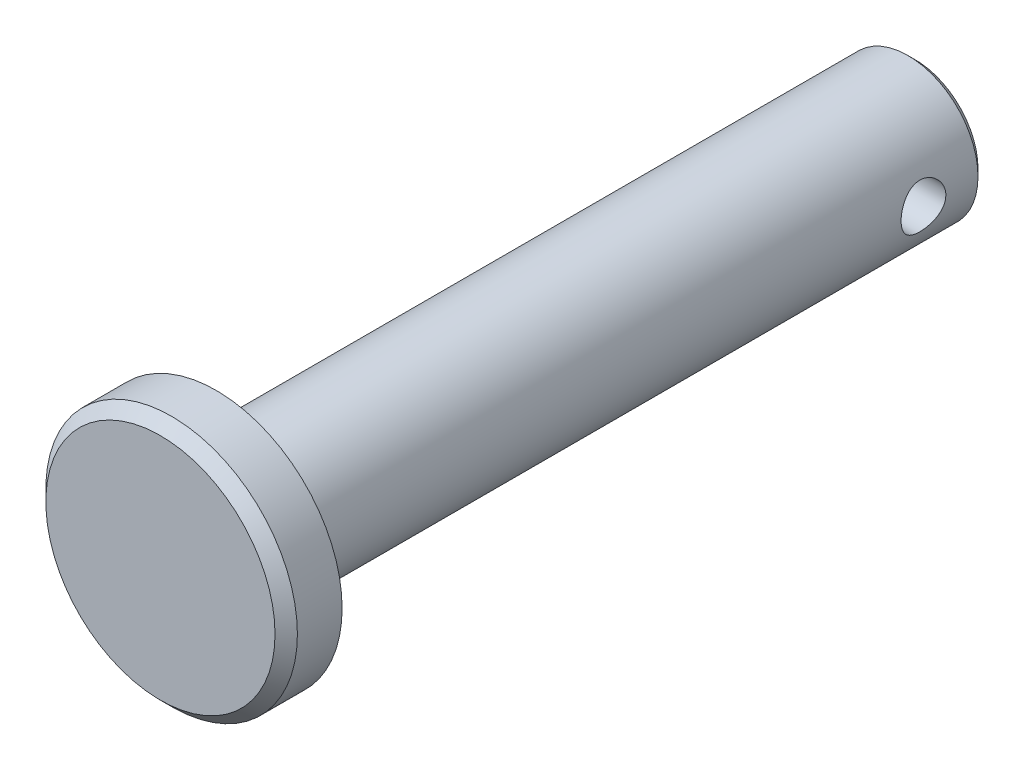
ISO-10303-21;
HEADER;
FILE_DESCRIPTION(('STEP AP214'),'2;1');
FILE_NAME('part.step','',(''),(''),'','','');
FILE_SCHEMA(('AUTOMOTIVE_DESIGN { 1 0 10303 214 1 1 1 1 }'));
ENDSEC;
DATA;
#1=APPLICATION_CONTEXT('core data for automotive mechanical design processes');
#2=APPLICATION_PROTOCOL_DEFINITION('international standard','automotive_design',2000,#1);
#3=PRODUCT_CONTEXT('',#1,'mechanical');
#4=PRODUCT('Part','Part','',(#3));
#5=PRODUCT_RELATED_PRODUCT_CATEGORY('part','',(#4));
#6=PRODUCT_DEFINITION_FORMATION('','',#4);
#7=PRODUCT_DEFINITION_CONTEXT('part definition',#1,'design');
#8=PRODUCT_DEFINITION('design','',#6,#7);
#9=PRODUCT_DEFINITION_SHAPE('','',#8);
#10=(LENGTH_UNIT() NAMED_UNIT(*) SI_UNIT(.MILLI.,.METRE.));
#11=(NAMED_UNIT(*) PLANE_ANGLE_UNIT() SI_UNIT($,.RADIAN.));
#12=(NAMED_UNIT(*) SI_UNIT($,.STERADIAN.) SOLID_ANGLE_UNIT());
#13=UNCERTAINTY_MEASURE_WITH_UNIT(LENGTH_MEASURE(1.E-05),#10,'distance_accuracy_value','');
#14=(GEOMETRIC_REPRESENTATION_CONTEXT(3) GLOBAL_UNCERTAINTY_ASSIGNED_CONTEXT((#13)) GLOBAL_UNIT_ASSIGNED_CONTEXT((#10,
#11,#12)) REPRESENTATION_CONTEXT('',''));
#15=CARTESIAN_POINT('',(0.,0.,0.));
#16=DIRECTION('',(0.,0.,1.));
#17=DIRECTION('',(1.,0.,0.));
#18=AXIS2_PLACEMENT_3D('',#15,#16,#17);
#19=CARTESIAN_POINT('',(0.,0.,25.));
#20=DIRECTION('',(0.,0.,-1.));
#21=DIRECTION('',(-1.,0.,0.));
#22=AXIS2_PLACEMENT_3D('',#19,#20,#21);
#23=CYLINDRICAL_SURFACE('',#22,5.);
#24=CARTESIAN_POINT('',(0.,0.,-24.5));
#25=DIRECTION('',(0.,0.,1.));
#26=DIRECTION('',(1.,0.,0.));
#27=AXIS2_PLACEMENT_3D('',#24,#25,#26);
#28=CIRCLE('',#27,5.);
#29=CARTESIAN_POINT('',(5.,0.,-24.5));
#30=VERTEX_POINT('',#29);
#31=EDGE_CURVE('E57',#30,#30,#28,.T.);
#32=ORIENTED_EDGE('',*,*,#31,.T.);
#33=EDGE_LOOP('',(#32));
#34=FACE_BOUND('',#33,.T.);
#35=CARTESIAN_POINT('',(-5.,0.,-19.));
#36=CARTESIAN_POINT('',(-4.99999978543627,-0.0874958063159799,-19.0000002436506));
#37=CARTESIAN_POINT('',(-4.99768184156355,-0.174994637059061,-19.0072005952793));
#38=CARTESIAN_POINT('',(-4.98866262172227,-0.347426901237484,-19.0357318195293));
#39=CARTESIAN_POINT('',(-4.98196054553558,-0.432359863373709,-19.0570652718179));
#40=CARTESIAN_POINT('',(-4.9649038363541,-0.597149225791566,-19.1130649212118));
#41=CARTESIAN_POINT('',(-4.95455502045191,-0.677013473384596,-19.1477098923706));
#42=CARTESIAN_POINT('',(-4.93126901642872,-0.829798762851158,-19.2292568300873));
#43=CARTESIAN_POINT('',(-4.91833138300386,-0.902718607024947,-19.2761609057656));
#44=CARTESIAN_POINT('',(-4.89077067933825,-1.04189475779498,-19.382484113504));
#45=CARTESIAN_POINT('',(-4.87610957732918,-1.1078960922464,-19.4422270989534));
#46=CARTESIAN_POINT('',(-4.8469706570307,-1.22913423693228,-19.5718430665474));
#47=CARTESIAN_POINT('',(-4.83249287552328,-1.28436891793797,-19.6417180476549));
#48=CARTESIAN_POINT('',(-4.80494810799029,-1.38391395073832,-19.7918528545104));
#49=CARTESIAN_POINT('',(-4.79192785635417,-1.42790123109944,-19.8723362812705));
#50=CARTESIAN_POINT('',(-4.76934657798646,-1.5016091713459,-20.0400423437701));
#51=CARTESIAN_POINT('',(-4.75978458968016,-1.53133379773327,-20.1272630979883));
#52=CARTESIAN_POINT('',(-4.74560122760597,-1.57473134311322,-20.3030826072729));
#53=CARTESIAN_POINT('',(-4.74083414932744,-1.58887896846386,-20.391552101752));
#54=CARTESIAN_POINT('',(-4.73634831045,-1.60220433058851,-20.5697275991845));
#55=CARTESIAN_POINT('',(-4.73662813227306,-1.6013862709372,-20.659433247852));
#56=CARTESIAN_POINT('',(-4.74207619100075,-1.58517380736381,-20.8335655848882));
#57=CARTESIAN_POINT('',(-4.7470401743042,-1.57038842132725,-20.9180564534447));
#58=CARTESIAN_POINT('',(-4.76096457446162,-1.52765058974139,-21.0832888444221));
#59=CARTESIAN_POINT('',(-4.76992543490025,-1.49969668269327,-21.1640299495852));
#60=CARTESIAN_POINT('',(-4.7909865416364,-1.43099645158812,-21.3208978588257));
#61=CARTESIAN_POINT('',(-4.80313229469362,-1.39006273103723,-21.3969362199515));
#62=CARTESIAN_POINT('',(-4.82917444861168,-1.29669494334068,-21.5412620430268));
#63=CARTESIAN_POINT('',(-4.8430713221454,-1.24425776827155,-21.6095474027435));
#64=CARTESIAN_POINT('',(-4.87186372141871,-1.12640551540387,-21.7398646728663));
#65=CARTESIAN_POINT('',(-4.8867752080818,-1.06048936249402,-21.8014407769388));
#66=CARTESIAN_POINT('',(-4.91533168114877,-0.919081432217151,-21.9127786782336));
#67=CARTESIAN_POINT('',(-4.92897656433707,-0.843588875652697,-21.9625395131429));
#68=CARTESIAN_POINT('',(-4.95361789744584,-0.684261580712376,-22.0491634432802));
#69=CARTESIAN_POINT('',(-4.96459080547942,-0.600361279440636,-22.0859131008364));
#70=CARTESIAN_POINT('',(-4.98248161100196,-0.42713585036113,-22.1446395966627));
#71=CARTESIAN_POINT('',(-4.98940080204637,-0.337812463131548,-22.1666211478167));
#72=CARTESIAN_POINT('',(-4.99819424239135,-0.160141789589318,-22.1944000666652));
#73=CARTESIAN_POINT('',(-5.00026060178154,-0.0719002860170731,-22.2008140736111));
#74=CARTESIAN_POINT('',(-4.99968655318444,0.104410269588106,-22.1990207817787));
#75=CARTESIAN_POINT('',(-4.99704687004206,0.19247934608744,-22.1908157346901));
#76=CARTESIAN_POINT('',(-4.98748380317497,0.363535018203813,-22.1605098869188));
#77=CARTESIAN_POINT('',(-4.98067486649266,0.446594362478024,-22.1387800899141));
#78=CARTESIAN_POINT('',(-4.96357585995349,0.607861654600584,-22.0824982006037));
#79=CARTESIAN_POINT('',(-4.95328535439547,0.686068993794125,-22.0479445033978));
#80=CARTESIAN_POINT('',(-4.92995531019905,0.837596923870446,-21.9660289828218));
#81=CARTESIAN_POINT('',(-4.9168532627009,0.910745620500969,-21.9183674880577));
#82=CARTESIAN_POINT('',(-4.8893940824048,1.04821150300662,-21.8119461270144));
#83=CARTESIAN_POINT('',(-4.87503659432078,1.11252617555399,-21.7531831135417));
#84=CARTESIAN_POINT('',(-4.84592967283237,1.23328321488635,-21.623325840389));
#85=CARTESIAN_POINT('',(-4.83118884166735,1.2892857947562,-21.5518197323115));
#86=CARTESIAN_POINT('',(-4.80360443110145,1.38854141992569,-21.4001053255418));
#87=CARTESIAN_POINT('',(-4.79076083607138,1.43179457025642,-21.319897098546));
#88=CARTESIAN_POINT('',(-4.76856262886575,1.50407580301232,-21.1531564213439));
#89=CARTESIAN_POINT('',(-4.75919656820051,1.53315066307446,-21.0666458650103));
#90=CARTESIAN_POINT('',(-4.74511281699328,1.57620668246201,-20.8895927901897));
#91=CARTESIAN_POINT('',(-4.74039324536734,1.59019395006567,-20.799051918864));
#92=CARTESIAN_POINT('',(-4.73633927898768,1.60222535311566,-20.621124030836));
#93=CARTESIAN_POINT('',(-4.73676019091382,1.60099388446006,-20.533790988671));
#94=CARTESIAN_POINT('',(-4.74234159093745,1.5843835514937,-20.3606429945653));
#95=CARTESIAN_POINT('',(-4.74750183734632,1.56900540861121,-20.274827965439));
#96=CARTESIAN_POINT('',(-4.76180543144416,1.52503332416461,-20.1085165746231));
#97=CARTESIAN_POINT('',(-4.77088327236763,1.49665627942707,-20.0279568011071));
#98=CARTESIAN_POINT('',(-4.79197975594362,1.42766427484382,-19.8726782395992));
#99=CARTESIAN_POINT('',(-4.8039990169992,1.38704674114626,-19.7979606842373));
#100=CARTESIAN_POINT('',(-4.83023494368376,1.29279266707432,-19.6531903701856));
#101=CARTESIAN_POINT('',(-4.8445211905268,1.23869308431579,-19.583451737266));
#102=CARTESIAN_POINT('',(-4.87337180847354,1.11981399792885,-19.453808254179));
#103=CARTESIAN_POINT('',(-4.88793625446696,1.05503158166823,-19.3939060948013));
#104=CARTESIAN_POINT('',(-4.91631108200117,0.913912210298352,-19.2835417140762));
#105=CARTESIAN_POINT('',(-4.93007751880386,0.83725135176078,-19.2334810481157));
#106=CARTESIAN_POINT('',(-4.95473787697861,0.676163529926937,-19.1470198119028));
#107=CARTESIAN_POINT('',(-4.96563279071293,0.591739263208158,-19.1106145206792));
#108=CARTESIAN_POINT('',(-4.98268341064065,0.423663431644846,-19.0547522201696));
#109=CARTESIAN_POINT('',(-4.98911901301451,0.340376766487331,-19.0342815494169));
#110=CARTESIAN_POINT('',(-4.99777693541394,0.171394001076119,-19.006906857096));
#111=CARTESIAN_POINT('',(-5.00000021015613,0.0856984512613948,-18.9999997613545));
#112=CARTESIAN_POINT('',(-5.,0.,-19.));
#113=B_SPLINE_CURVE_WITH_KNOTS('',3,(#35,#36,#37,#38,#39,#40,#41,#42,#43,#44,#45,#46,#47,#48,
#49,#50,#51,#52,#53,#54,#55,#56,#57,#58,#59,#60,#61,#62,#63,#64,#65,#66,#67,#68,#69,#70,#71,#72,
#73,#74,#75,#76,#77,#78,#79,#80,#81,#82,#83,#84,#85,#86,#87,#88,#89,#90,#91,#92,#93,#94,#95,#96,
#97,#98,#99,#100,#101,#102,#103,#104,#105,#106,#107,#108,#109,#110,#111,#112),.UNSPECIFIED.,.T.,
.F.,(4,2,2,2,2,2,2,2,2,2,2,2,2,2,2,2,2,2,2,2,2,2,2,2,2,2,2,2,2,2,2,2,2,2,2,2,2,2,4),(0.,
0.262172289866488,0.524392446348365,0.786196202111713,1.04804502964703,1.31749718151567,
1.58700256668426,1.86354828826627,2.14001705671955,2.40780489999507,2.67551752794224,
2.93207089351446,3.18865273918779,3.44912195934764,3.7096616381301,3.98267284808624,
4.25570628624555,4.53106471334195,4.80633522466349,5.07051010591345,5.334644301327,
5.59183416387789,5.84905622438334,6.11273355055082,6.3764857396482,6.6512299305306,
6.92597185797943,7.19980110675105,7.47351945288797,7.73426134972847,7.99498995042989,
8.25151822881317,8.50810048600705,8.77513756675923,9.04224757485585,9.31866285531261,
9.59498248449731,9.85182740305349,10.1086141011962),.UNSPECIFIED.);
#114=CARTESIAN_POINT('',(-5.,0.,-19.));
#115=VERTEX_POINT('',#114);
#116=EDGE_CURVE('E72',#115,#115,#113,.T.);
#117=ORIENTED_EDGE('',*,*,#116,.T.);
#118=EDGE_LOOP('',(#117));
#119=FACE_BOUND('',#118,.T.);
#120=CARTESIAN_POINT('',(5.,0.,-22.2));
#121=CARTESIAN_POINT('',(4.99999978543627,-0.0874958063159799,-22.1999997563494));
#122=CARTESIAN_POINT('',(4.99768184156355,-0.174994637059061,-22.1927994047207));
#123=CARTESIAN_POINT('',(4.98866262172227,-0.347426901237483,-22.1642681804707));
#124=CARTESIAN_POINT('',(4.98196054553558,-0.432359863373709,-22.1429347281821));
#125=CARTESIAN_POINT('',(4.9649038363541,-0.597149225791566,-22.0869350787882));
#126=CARTESIAN_POINT('',(4.95455502045191,-0.677013473384597,-22.0522901076294));
#127=CARTESIAN_POINT('',(4.93126901642872,-0.829798762851159,-21.9707431699127));
#128=CARTESIAN_POINT('',(4.91833138300386,-0.902718607024948,-21.9238390942344));
#129=CARTESIAN_POINT('',(4.89077067933825,-1.04189475779498,-21.817515886496));
#130=CARTESIAN_POINT('',(4.87610957732918,-1.1078960922464,-21.7577729010466));
#131=CARTESIAN_POINT('',(4.8469706570307,-1.22913423693228,-21.6281569334526));
#132=CARTESIAN_POINT('',(4.83249287552328,-1.28436891793797,-21.5582819523451));
#133=CARTESIAN_POINT('',(4.80494810799029,-1.38391395073832,-21.4081471454896));
#134=CARTESIAN_POINT('',(4.79192785635417,-1.42790123109944,-21.3276637187295));
#135=CARTESIAN_POINT('',(4.76934657798645,-1.5016091713459,-21.1599576562299));
#136=CARTESIAN_POINT('',(4.75978458968016,-1.53133379773327,-21.0727369020117));
#137=CARTESIAN_POINT('',(4.74560122760597,-1.57473134311322,-20.8969173927271));
#138=CARTESIAN_POINT('',(4.74083414932744,-1.58887896846386,-20.808447898248));
#139=CARTESIAN_POINT('',(4.73634831045,-1.60220433058851,-20.6302724008155));
#140=CARTESIAN_POINT('',(4.73662813227306,-1.6013862709372,-20.540566752148));
#141=CARTESIAN_POINT('',(4.74207619100075,-1.58517380736381,-20.3664344151118));
#142=CARTESIAN_POINT('',(4.7470401743042,-1.57038842132725,-20.2819435465553));
#143=CARTESIAN_POINT('',(4.76096457446162,-1.52765058974139,-20.1167111555779));
#144=CARTESIAN_POINT('',(4.76992543490025,-1.49969668269327,-20.0359700504148));
#145=CARTESIAN_POINT('',(4.7909865416364,-1.43099645158812,-19.8791021411743));
#146=CARTESIAN_POINT('',(4.80313229469362,-1.39006273103723,-19.8030637800485));
#147=CARTESIAN_POINT('',(4.82917444861168,-1.29669494334068,-19.6587379569732));
#148=CARTESIAN_POINT('',(4.8430713221454,-1.24425776827155,-19.5904525972565));
#149=CARTESIAN_POINT('',(4.87186372141871,-1.12640551540387,-19.4601353271337));
#150=CARTESIAN_POINT('',(4.8867752080818,-1.06048936249402,-19.3985592230612));
#151=CARTESIAN_POINT('',(4.91533168114877,-0.919081432217151,-19.2872213217663));
#152=CARTESIAN_POINT('',(4.92897656433707,-0.843588875652697,-19.2374604868571));
#153=CARTESIAN_POINT('',(4.95361789744584,-0.684261580712376,-19.1508365567198));
#154=CARTESIAN_POINT('',(4.96459080547942,-0.600361279440637,-19.1140868991636));
#155=CARTESIAN_POINT('',(4.98248161100196,-0.427135850361131,-19.0553604033373));
#156=CARTESIAN_POINT('',(4.98940080204637,-0.337812463131549,-19.0333788521833));
#157=CARTESIAN_POINT('',(4.99819424239135,-0.160141789589318,-19.0055999333348));
#158=CARTESIAN_POINT('',(5.00026060178154,-0.0719002860170738,-18.9991859263889));
#159=CARTESIAN_POINT('',(4.99968655318444,0.104410269588106,-19.0009792182213));
#160=CARTESIAN_POINT('',(4.99704687004206,0.19247934608744,-19.0091842653099));
#161=CARTESIAN_POINT('',(4.98748380317497,0.363535018203813,-19.0394901130812));
#162=CARTESIAN_POINT('',(4.98067486649266,0.446594362478024,-19.0612199100859));
#163=CARTESIAN_POINT('',(4.96357585995349,0.607861654600583,-19.1175017993962));
#164=CARTESIAN_POINT('',(4.95328535439547,0.686068993794125,-19.1520554966022));
#165=CARTESIAN_POINT('',(4.92995531019905,0.837596923870446,-19.2339710171781));
#166=CARTESIAN_POINT('',(4.9168532627009,0.910745620500968,-19.2816325119423));
#167=CARTESIAN_POINT('',(4.8893940824048,1.04821150300662,-19.3880538729856));
#168=CARTESIAN_POINT('',(4.87503659432078,1.11252617555398,-19.4468168864583));
#169=CARTESIAN_POINT('',(4.84592967283237,1.23328321488635,-19.576674159611));
#170=CARTESIAN_POINT('',(4.83118884166735,1.2892857947562,-19.6481802676885));
#171=CARTESIAN_POINT('',(4.80360443110145,1.38854141992569,-19.7998946744582));
#172=CARTESIAN_POINT('',(4.79076083607138,1.43179457025642,-19.880102901454));
#173=CARTESIAN_POINT('',(4.76856262886575,1.50407580301232,-20.0468435786561));
#174=CARTESIAN_POINT('',(4.75919656820051,1.53315066307446,-20.1333541349897));
#175=CARTESIAN_POINT('',(4.74511281699328,1.57620668246201,-20.3104072098103));
#176=CARTESIAN_POINT('',(4.74039324536734,1.59019395006567,-20.400948081136));
#177=CARTESIAN_POINT('',(4.73633927898768,1.60222535311566,-20.578875969164));
#178=CARTESIAN_POINT('',(4.73676019091382,1.60099388446006,-20.666209011329));
#179=CARTESIAN_POINT('',(4.74234159093745,1.5843835514937,-20.8393570054347));
#180=CARTESIAN_POINT('',(4.74750183734632,1.56900540861121,-20.925172034561));
#181=CARTESIAN_POINT('',(4.76180543144416,1.52503332416461,-21.0914834253769));
#182=CARTESIAN_POINT('',(4.77088327236763,1.49665627942707,-21.1720431988929));
#183=CARTESIAN_POINT('',(4.79197975594362,1.42766427484382,-21.3273217604008));
#184=CARTESIAN_POINT('',(4.8039990169992,1.38704674114626,-21.4020393157627));
#185=CARTESIAN_POINT('',(4.83023494368376,1.29279266707432,-21.5468096298144));
#186=CARTESIAN_POINT('',(4.8445211905268,1.23869308431579,-21.616548262734));
#187=CARTESIAN_POINT('',(4.87337180847354,1.11981399792885,-21.746191745821));
#188=CARTESIAN_POINT('',(4.88793625446696,1.05503158166823,-21.8060939051986));
#189=CARTESIAN_POINT('',(4.91631108200117,0.913912210298353,-21.9164582859238));
#190=CARTESIAN_POINT('',(4.93007751880386,0.837251351760782,-21.9665189518843));
#191=CARTESIAN_POINT('',(4.9547378769786,0.67616352992694,-22.0529801880972));
#192=CARTESIAN_POINT('',(4.96563279071293,0.591739263208159,-22.0893854793208));
#193=CARTESIAN_POINT('',(4.98268341064065,0.423663431644847,-22.1452477798304));
#194=CARTESIAN_POINT('',(4.98911901301451,0.340376766487332,-22.1657184505831));
#195=CARTESIAN_POINT('',(4.99777693541394,0.171394001076121,-22.193093142904));
#196=CARTESIAN_POINT('',(5.00000021015613,0.0856984512613955,-22.2000002386455));
#197=CARTESIAN_POINT('',(5.,0.,-22.2));
#198=B_SPLINE_CURVE_WITH_KNOTS('',3,(#120,#121,#122,#123,#124,#125,#126,#127,#128,#129,#130,
#131,#132,#133,#134,#135,#136,#137,#138,#139,#140,#141,#142,#143,#144,#145,#146,#147,#148,#149,
#150,#151,#152,#153,#154,#155,#156,#157,#158,#159,#160,#161,#162,#163,#164,#165,#166,#167,#168,
#169,#170,#171,#172,#173,#174,#175,#176,#177,#178,#179,#180,#181,#182,#183,#184,#185,#186,#187,
#188,#189,#190,#191,#192,#193,#194,#195,#196,#197),.UNSPECIFIED.,.T.,.F.,(4,2,2,2,2,2,2,2,2,2,2,
2,2,2,2,2,2,2,2,2,2,2,2,2,2,2,2,2,2,2,2,2,2,2,2,2,2,2,4),(0.,0.262172289866488,
0.524392446348365,0.786196202111715,1.04804502964703,1.31749718151567,1.58700256668426,
1.86354828826627,2.14001705671955,2.40780489999507,2.67551752794224,2.93207089351446,
3.18865273918779,3.44912195934764,3.7096616381301,3.98267284808624,4.25570628624555,
4.53106471334195,4.80633522466349,5.07051010591345,5.334644301327,5.59183416387789,
5.84905622438334,6.11273355055082,6.37648573964819,6.6512299305306,6.92597185797943,
7.19980110675105,7.47351945288796,7.73426134972847,7.99498995042989,8.25151822881316,
8.50810048600705,8.77513756675923,9.04224757485584,9.3186628553126,9.5949824844973,
9.85182740305348,10.1086141011962),.UNSPECIFIED.);
#199=CARTESIAN_POINT('',(5.,0.,-22.2));
#200=VERTEX_POINT('',#199);
#201=EDGE_CURVE('E82',#200,#200,#198,.T.);
#202=ORIENTED_EDGE('',*,*,#201,.T.);
#203=EDGE_LOOP('',(#202));
#204=FACE_BOUND('',#203,.T.);
#205=CARTESIAN_POINT('',(0.,0.,25.));
#206=DIRECTION('',(0.,0.,1.));
#207=DIRECTION('',(1.,0.,0.));
#208=AXIS2_PLACEMENT_3D('',#205,#206,#207);
#209=CIRCLE('',#208,5.);
#210=CARTESIAN_POINT('',(5.,0.,25.));
#211=VERTEX_POINT('',#210);
#212=EDGE_CURVE('E121',#211,#211,#209,.T.);
#213=ORIENTED_EDGE('',*,*,#212,.F.);
#214=EDGE_LOOP('',(#213));
#215=FACE_BOUND('',#214,.T.);
#216=ADVANCED_FACE('F49',(#34,#119,#204,#215),#23,.T.);
#217=CARTESIAN_POINT('',(0.,0.,-25.));
#218=DIRECTION('',(0.,0.,1.));
#219=DIRECTION('',(1.,0.,0.));
#220=AXIS2_PLACEMENT_3D('',#217,#218,#219);
#221=PLANE('',#220);
#222=CARTESIAN_POINT('',(0.,0.,-25.));
#223=DIRECTION('',(0.,0.,1.));
#224=DIRECTION('',(1.,0.,0.));
#225=AXIS2_PLACEMENT_3D('',#222,#223,#224);
#226=CIRCLE('',#225,4.5);
#227=CARTESIAN_POINT('',(4.5,0.,-25.));
#228=VERTEX_POINT('',#227);
#229=EDGE_CURVE('E10',#228,#228,#226,.F.);
#230=ORIENTED_EDGE('',*,*,#229,.T.);
#231=EDGE_LOOP('',(#230));
#232=FACE_BOUND('',#231,.T.);
#233=ADVANCED_FACE('F103',(#232),#221,.F.);
#234=CARTESIAN_POINT('',(0.,0.,25.));
#235=DIRECTION('',(0.,0.,1.));
#236=DIRECTION('',(1.,0.,0.));
#237=AXIS2_PLACEMENT_3D('',#234,#235,#236);
#238=PLANE('',#237);
#239=CARTESIAN_POINT('',(0.,0.,25.));
#240=DIRECTION('',(0.,0.,1.));
#241=DIRECTION('',(1.,0.,0.));
#242=AXIS2_PLACEMENT_3D('',#239,#240,#241);
#243=CIRCLE('',#242,9.);
#244=CARTESIAN_POINT('',(9.,0.,25.));
#245=VERTEX_POINT('',#244);
#246=EDGE_CURVE('E81',#245,#245,#243,.T.);
#247=ORIENTED_EDGE('',*,*,#246,.F.);
#248=EDGE_LOOP('',(#247));
#249=FACE_BOUND('',#248,.T.);
#250=ORIENTED_EDGE('',*,*,#212,.T.);
#251=EDGE_LOOP('',(#250));
#252=FACE_BOUND('',#251,.T.);
#253=ADVANCED_FACE('F100',(#249,#252),#238,.F.);
#254=CARTESIAN_POINT('',(0.,0.,29.));
#255=DIRECTION('',(0.,0.,-1.));
#256=DIRECTION('',(-1.,0.,0.));
#257=AXIS2_PLACEMENT_3D('',#254,#255,#256);
#258=CYLINDRICAL_SURFACE('',#257,9.);
#259=CARTESIAN_POINT('',(0.,0.,28.2));
#260=DIRECTION('',(0.,0.,1.));
#261=DIRECTION('',(1.,0.,0.));
#262=AXIS2_PLACEMENT_3D('',#259,#260,#261);
#263=CIRCLE('',#262,9.);
#264=CARTESIAN_POINT('',(9.,0.,28.2));
#265=VERTEX_POINT('',#264);
#266=EDGE_CURVE('E63',#265,#265,#263,.F.);
#267=ORIENTED_EDGE('',*,*,#266,.T.);
#268=EDGE_LOOP('',(#267));
#269=FACE_BOUND('',#268,.T.);
#270=ORIENTED_EDGE('',*,*,#246,.T.);
#271=EDGE_LOOP('',(#270));
#272=FACE_BOUND('',#271,.T.);
#273=ADVANCED_FACE('F98',(#269,#272),#258,.T.);
#274=CARTESIAN_POINT('',(0.,0.,29.));
#275=DIRECTION('',(0.,0.,1.));
#276=DIRECTION('',(1.,0.,0.));
#277=AXIS2_PLACEMENT_3D('',#274,#275,#276);
#278=PLANE('',#277);
#279=CARTESIAN_POINT('',(0.,0.,29.));
#280=DIRECTION('',(0.,0.,1.));
#281=DIRECTION('',(1.,0.,0.));
#282=AXIS2_PLACEMENT_3D('',#279,#280,#281);
#283=CIRCLE('',#282,8.2);
#284=CARTESIAN_POINT('',(8.2,0.,29.));
#285=VERTEX_POINT('',#284);
#286=EDGE_CURVE('E69',#285,#285,#283,.T.);
#287=ORIENTED_EDGE('',*,*,#286,.T.);
#288=EDGE_LOOP('',(#287));
#289=FACE_BOUND('',#288,.T.);
#290=ADVANCED_FACE('F94',(#289),#278,.T.);
#291=CARTESIAN_POINT('',(0.,0.,29.));
#292=DIRECTION('',(0.,0.,-1.));
#293=DIRECTION('',(-1.,0.,0.));
#294=AXIS2_PLACEMENT_3D('',#291,#292,#293);
#295=CONICAL_SURFACE('',#294,8.2,0.785398163397447);
#296=ORIENTED_EDGE('',*,*,#266,.F.);
#297=EDGE_LOOP('',(#296));
#298=FACE_BOUND('',#297,.T.);
#299=ORIENTED_EDGE('',*,*,#286,.F.);
#300=EDGE_LOOP('',(#299));
#301=FACE_BOUND('',#300,.T.);
#302=ADVANCED_FACE('F92',(#298,#301),#295,.T.);
#303=CARTESIAN_POINT('',(-9.,0.,-20.6));
#304=DIRECTION('',(1.,0.,0.));
#305=DIRECTION('',(0.,0.,-1.));
#306=AXIS2_PLACEMENT_3D('',#303,#304,#305);
#307=CYLINDRICAL_SURFACE('',#306,1.6);
#308=ORIENTED_EDGE('',*,*,#201,.F.);
#309=EDGE_LOOP('',(#308));
#310=FACE_BOUND('',#309,.T.);
#311=ORIENTED_EDGE('',*,*,#116,.F.);
#312=EDGE_LOOP('',(#311));
#313=FACE_BOUND('',#312,.T.);
#314=ADVANCED_FACE('F88',(#310,#313),#307,.F.);
#315=CARTESIAN_POINT('',(0.,0.,-24.5));
#316=DIRECTION('',(0.,0.,1.));
#317=DIRECTION('',(1.,0.,0.));
#318=AXIS2_PLACEMENT_3D('',#315,#316,#317);
#319=CONICAL_SURFACE('',#318,5.,0.785398163397451);
#320=ORIENTED_EDGE('',*,*,#229,.F.);
#321=EDGE_LOOP('',(#320));
#322=FACE_BOUND('',#321,.T.);
#323=ORIENTED_EDGE('',*,*,#31,.F.);
#324=EDGE_LOOP('',(#323));
#325=FACE_BOUND('',#324,.T.);
#326=ADVANCED_FACE('F51',(#322,#325),#319,.T.);
#327=CLOSED_SHELL('',(#216,#233,#253,#273,#290,#302,#314,#326));
#328=MANIFOLD_SOLID_BREP('B2',#327);
#329=ADVANCED_BREP_SHAPE_REPRESENTATION('',(#18,#328),#14);
#330=SHAPE_DEFINITION_REPRESENTATION(#9,#329);
ENDSEC;
END-ISO-10303-21;
